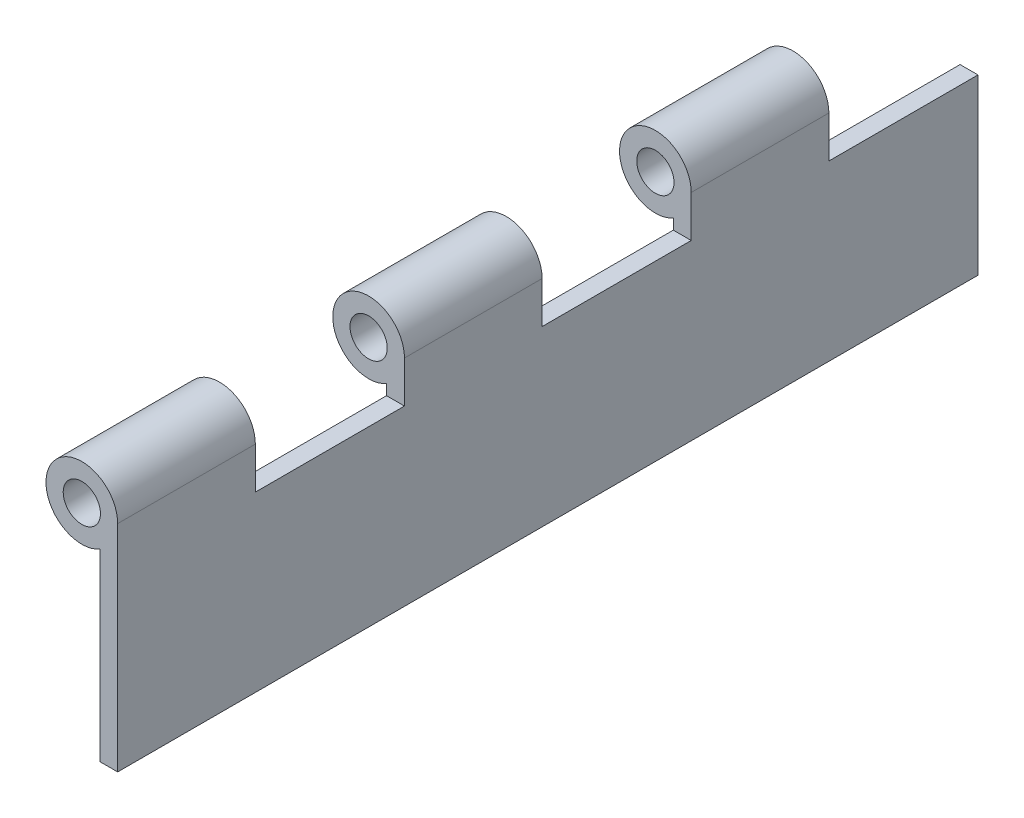
ISO-10303-21;
HEADER;
FILE_DESCRIPTION(('STEP AP214'),'2;1');
FILE_NAME('part.step','',(''),(''),'','','');
FILE_SCHEMA(('AUTOMOTIVE_DESIGN { 1 0 10303 214 1 1 1 1 }'));
ENDSEC;
DATA;
#1=APPLICATION_CONTEXT('core data for automotive mechanical design processes');
#2=APPLICATION_PROTOCOL_DEFINITION('international standard','automotive_design',2000,#1);
#3=PRODUCT_CONTEXT('',#1,'mechanical');
#4=PRODUCT('Part','Part','',(#3));
#5=PRODUCT_RELATED_PRODUCT_CATEGORY('part','',(#4));
#6=PRODUCT_DEFINITION_FORMATION('','',#4);
#7=PRODUCT_DEFINITION_CONTEXT('part definition',#1,'design');
#8=PRODUCT_DEFINITION('design','',#6,#7);
#9=PRODUCT_DEFINITION_SHAPE('','',#8);
#10=(LENGTH_UNIT() NAMED_UNIT(*) SI_UNIT(.MILLI.,.METRE.));
#11=(NAMED_UNIT(*) PLANE_ANGLE_UNIT() SI_UNIT($,.RADIAN.));
#12=(NAMED_UNIT(*) SI_UNIT($,.STERADIAN.) SOLID_ANGLE_UNIT());
#13=UNCERTAINTY_MEASURE_WITH_UNIT(LENGTH_MEASURE(1.E-05),#10,'distance_accuracy_value','');
#14=(GEOMETRIC_REPRESENTATION_CONTEXT(3) GLOBAL_UNCERTAINTY_ASSIGNED_CONTEXT((#13)) GLOBAL_UNIT_ASSIGNED_CONTEXT((#10,
#11,#12)) REPRESENTATION_CONTEXT('',''));
#15=CARTESIAN_POINT('',(0.,0.,0.));
#16=DIRECTION('',(0.,0.,1.));
#17=DIRECTION('',(1.,0.,0.));
#18=AXIS2_PLACEMENT_3D('',#15,#16,#17);
#19=CARTESIAN_POINT('',(-1.58750000000001,19.05,76.2));
#20=DIRECTION('',(0.,0.,-1.));
#21=DIRECTION('',(-1.,0.,0.));
#22=AXIS2_PLACEMENT_3D('',#19,#20,#21);
#23=CYLINDRICAL_SURFACE('',#22,1.651);
#24=CARTESIAN_POINT('',(-1.58750000000001,19.05,25.4));
#25=DIRECTION('',(0.,0.,-1.));
#26=DIRECTION('',(-1.,0.,0.));
#27=AXIS2_PLACEMENT_3D('',#24,#25,#26);
#28=CIRCLE('',#27,1.651);
#29=CARTESIAN_POINT('',(-3.23850000000001,19.05,25.4));
#30=VERTEX_POINT('',#29);
#31=EDGE_CURVE('E196',#30,#30,#28,.F.);
#32=ORIENTED_EDGE('',*,*,#31,.T.);
#33=EDGE_LOOP('',(#32));
#34=FACE_BOUND('',#33,.T.);
#35=CARTESIAN_POINT('',(-1.58750000000001,19.05,13.208));
#36=DIRECTION('',(0.,0.,-1.));
#37=DIRECTION('',(-1.,0.,0.));
#38=AXIS2_PLACEMENT_3D('',#35,#36,#37);
#39=CIRCLE('',#38,1.651);
#40=CARTESIAN_POINT('',(-3.23850000000001,19.05,13.208));
#41=VERTEX_POINT('',#40);
#42=EDGE_CURVE('E20',#41,#41,#39,.T.);
#43=ORIENTED_EDGE('',*,*,#42,.T.);
#44=EDGE_LOOP('',(#43));
#45=FACE_BOUND('',#44,.T.);
#46=ADVANCED_FACE('F17',(#34,#45),#23,.F.);
#47=CARTESIAN_POINT('',(-1.58750000000001,19.05,76.2));
#48=DIRECTION('',(0.,0.,-1.));
#49=DIRECTION('',(-1.,0.,0.));
#50=AXIS2_PLACEMENT_3D('',#47,#48,#49);
#51=CYLINDRICAL_SURFACE('',#50,1.651);
#52=CARTESIAN_POINT('',(-1.58750000000001,19.05,38.608));
#53=DIRECTION('',(0.,0.,-1.));
#54=DIRECTION('',(-1.,0.,0.));
#55=AXIS2_PLACEMENT_3D('',#52,#53,#54);
#56=CIRCLE('',#55,1.651);
#57=CARTESIAN_POINT('',(-3.23850000000001,19.05,38.608));
#58=VERTEX_POINT('',#57);
#59=EDGE_CURVE('E219',#58,#58,#56,.T.);
#60=ORIENTED_EDGE('',*,*,#59,.T.);
#61=EDGE_LOOP('',(#60));
#62=FACE_BOUND('',#61,.T.);
#63=CARTESIAN_POINT('',(-1.58750000000001,19.05,50.8));
#64=DIRECTION('',(0.,0.,-1.));
#65=DIRECTION('',(-1.,0.,0.));
#66=AXIS2_PLACEMENT_3D('',#63,#64,#65);
#67=CIRCLE('',#66,1.651);
#68=CARTESIAN_POINT('',(-3.23850000000001,19.05,50.8));
#69=VERTEX_POINT('',#68);
#70=EDGE_CURVE('E184',#69,#69,#67,.F.);
#71=ORIENTED_EDGE('',*,*,#70,.T.);
#72=EDGE_LOOP('',(#71));
#73=FACE_BOUND('',#72,.T.);
#74=ADVANCED_FACE('F374',(#62,#73),#51,.F.);
#75=CARTESIAN_POINT('',(-1.58750000000001,19.05,76.2));
#76=DIRECTION('',(0.,0.,-1.));
#77=DIRECTION('',(-1.,0.,0.));
#78=AXIS2_PLACEMENT_3D('',#75,#76,#77);
#79=CYLINDRICAL_SURFACE('',#78,1.651);
#80=CARTESIAN_POINT('',(-1.58750000000001,19.05,64.008));
#81=DIRECTION('',(0.,0.,-1.));
#82=DIRECTION('',(-1.,0.,0.));
#83=AXIS2_PLACEMENT_3D('',#80,#81,#82);
#84=CIRCLE('',#83,1.651);
#85=CARTESIAN_POINT('',(-3.23850000000001,19.05,64.008));
#86=VERTEX_POINT('',#85);
#87=EDGE_CURVE('E209',#86,#86,#84,.T.);
#88=ORIENTED_EDGE('',*,*,#87,.T.);
#89=EDGE_LOOP('',(#88));
#90=FACE_BOUND('',#89,.T.);
#91=CARTESIAN_POINT('',(-1.58750000000001,19.05,76.2));
#92=DIRECTION('',(0.,0.,-1.));
#93=DIRECTION('',(-1.,0.,0.));
#94=AXIS2_PLACEMENT_3D('',#91,#92,#93);
#95=CIRCLE('',#94,1.651);
#96=CARTESIAN_POINT('',(-3.23850000000001,19.05,76.2));
#97=VERTEX_POINT('',#96);
#98=EDGE_CURVE('E201',#97,#97,#95,.T.);
#99=ORIENTED_EDGE('',*,*,#98,.F.);
#100=EDGE_LOOP('',(#99));
#101=FACE_BOUND('',#100,.T.);
#102=ADVANCED_FACE('F372',(#90,#101),#79,.F.);
#103=CARTESIAN_POINT('',(0.,0.,0.));
#104=DIRECTION('',(-1.,0.,0.));
#105=DIRECTION('',(0.,-1.,0.));
#106=AXIS2_PLACEMENT_3D('',#103,#104,#105);
#107=PLANE('',#106);
#108=DIRECTION('',(0.,0.,1.));
#109=VECTOR('',#108,1.);
#110=CARTESIAN_POINT('',(0.,16.3003693429844,0.));
#111=LINE('',#110,#109);
#112=CARTESIAN_POINT('',(0.,16.3003693429844,13.208));
#113=VERTEX_POINT('',#112);
#114=CARTESIAN_POINT('',(0.,16.3003693429844,25.4));
#115=VERTEX_POINT('',#114);
#116=EDGE_CURVE('E127',#113,#115,#111,.T.);
#117=ORIENTED_EDGE('',*,*,#116,.F.);
#118=DIRECTION('',(0.,1.,0.));
#119=VECTOR('',#118,1.);
#120=CARTESIAN_POINT('',(0.,22.225,13.208));
#121=LINE('',#120,#119);
#122=CARTESIAN_POINT('',(0.,15.367,13.208));
#123=VERTEX_POINT('',#122);
#124=EDGE_CURVE('E123',#113,#123,#121,.F.);
#125=ORIENTED_EDGE('',*,*,#124,.T.);
#126=DIRECTION('',(0.,0.,1.));
#127=VECTOR('',#126,1.);
#128=CARTESIAN_POINT('',(0.,15.367,6.604));
#129=LINE('',#128,#127);
#130=CARTESIAN_POINT('',(0.,15.367,0.));
#131=VERTEX_POINT('',#130);
#132=EDGE_CURVE('E151',#131,#123,#129,.T.);
#133=ORIENTED_EDGE('',*,*,#132,.F.);
#134=DIRECTION('',(0.,1.,0.));
#135=VECTOR('',#134,1.);
#136=CARTESIAN_POINT('',(0.,11.825400192215,0.));
#137=LINE('',#136,#135);
#138=CARTESIAN_POINT('',(0.,0.,0.));
#139=VERTEX_POINT('',#138);
#140=EDGE_CURVE('E161',#131,#139,#137,.F.);
#141=ORIENTED_EDGE('',*,*,#140,.T.);
#142=DIRECTION('',(0.,0.,1.));
#143=VECTOR('',#142,1.);
#144=CARTESIAN_POINT('',(0.,0.,0.));
#145=LINE('',#144,#143);
#146=CARTESIAN_POINT('',(0.,0.,76.2));
#147=VERTEX_POINT('',#146);
#148=EDGE_CURVE('E163',#147,#139,#145,.F.);
#149=ORIENTED_EDGE('',*,*,#148,.F.);
#150=DIRECTION('',(0.,1.,0.));
#151=VECTOR('',#150,1.);
#152=CARTESIAN_POINT('',(0.,11.825400192215,76.2));
#153=LINE('',#152,#151);
#154=CARTESIAN_POINT('',(0.,16.3003693429844,76.2));
#155=VERTEX_POINT('',#154);
#156=EDGE_CURVE('E204',#155,#147,#153,.F.);
#157=ORIENTED_EDGE('',*,*,#156,.F.);
#158=DIRECTION('',(0.,0.,1.));
#159=VECTOR('',#158,1.);
#160=CARTESIAN_POINT('',(0.,16.3003693429844,0.));
#161=LINE('',#160,#159);
#162=CARTESIAN_POINT('',(0.,16.3003693429844,64.008));
#163=VERTEX_POINT('',#162);
#164=EDGE_CURVE('E176',#163,#155,#161,.T.);
#165=ORIENTED_EDGE('',*,*,#164,.F.);
#166=DIRECTION('',(0.,1.,0.));
#167=VECTOR('',#166,1.);
#168=CARTESIAN_POINT('',(0.,22.225,64.008));
#169=LINE('',#168,#167);
#170=CARTESIAN_POINT('',(0.,15.367,64.008));
#171=VERTEX_POINT('',#170);
#172=EDGE_CURVE('E270',#163,#171,#169,.F.);
#173=ORIENTED_EDGE('',*,*,#172,.T.);
#174=DIRECTION('',(0.,0.,1.));
#175=VECTOR('',#174,1.);
#176=CARTESIAN_POINT('',(0.,15.367,57.404));
#177=LINE('',#176,#175);
#178=CARTESIAN_POINT('',(0.,15.367,50.8));
#179=VERTEX_POINT('',#178);
#180=EDGE_CURVE('E180',#179,#171,#177,.T.);
#181=ORIENTED_EDGE('',*,*,#180,.F.);
#182=DIRECTION('',(0.,1.,0.));
#183=VECTOR('',#182,1.);
#184=CARTESIAN_POINT('',(0.,22.225,50.8));
#185=LINE('',#184,#183);
#186=CARTESIAN_POINT('',(0.,16.3003693429844,50.8));
#187=VERTEX_POINT('',#186);
#188=EDGE_CURVE('E190',#179,#187,#185,.T.);
#189=ORIENTED_EDGE('',*,*,#188,.T.);
#190=DIRECTION('',(0.,0.,1.));
#191=VECTOR('',#190,1.);
#192=CARTESIAN_POINT('',(0.,16.3003693429844,0.));
#193=LINE('',#192,#191);
#194=CARTESIAN_POINT('',(0.,16.3003693429844,38.608));
#195=VERTEX_POINT('',#194);
#196=EDGE_CURVE('E187',#195,#187,#193,.T.);
#197=ORIENTED_EDGE('',*,*,#196,.F.);
#198=DIRECTION('',(0.,1.,0.));
#199=VECTOR('',#198,1.);
#200=CARTESIAN_POINT('',(0.,22.225,38.608));
#201=LINE('',#200,#199);
#202=CARTESIAN_POINT('',(0.,15.367,38.608));
#203=VERTEX_POINT('',#202);
#204=EDGE_CURVE('E238',#195,#203,#201,.F.);
#205=ORIENTED_EDGE('',*,*,#204,.T.);
#206=DIRECTION('',(0.,0.,1.));
#207=VECTOR('',#206,1.);
#208=CARTESIAN_POINT('',(0.,15.367,32.004));
#209=LINE('',#208,#207);
#210=CARTESIAN_POINT('',(0.,15.367,25.4));
#211=VERTEX_POINT('',#210);
#212=EDGE_CURVE('E192',#211,#203,#209,.T.);
#213=ORIENTED_EDGE('',*,*,#212,.F.);
#214=DIRECTION('',(0.,1.,0.));
#215=VECTOR('',#214,1.);
#216=CARTESIAN_POINT('',(0.,22.225,25.4));
#217=LINE('',#216,#215);
#218=EDGE_CURVE('E200',#211,#115,#217,.T.);
#219=ORIENTED_EDGE('',*,*,#218,.T.);
#220=EDGE_LOOP('',(#117,#125,#133,#141,#149,#157,#165,#173,#181,#189,#197,#205,#213,#219));
#221=FACE_BOUND('',#220,.T.);
#222=ADVANCED_FACE('F313',(#221),#107,.T.);
#223=CARTESIAN_POINT('',(-4.7625,22.225,13.208));
#224=DIRECTION('',(0.,0.,1.));
#225=DIRECTION('',(1.,0.,0.));
#226=AXIS2_PLACEMENT_3D('',#223,#224,#225);
#227=PLANE('',#226);
#228=ORIENTED_EDGE('',*,*,#42,.F.);
#229=EDGE_LOOP('',(#228));
#230=FACE_BOUND('',#229,.T.);
#231=DIRECTION('',(0.,1.,0.));
#232=VECTOR('',#231,1.);
#233=CARTESIAN_POINT('',(1.58749999999999,19.05,13.208));
#234=LINE('',#233,#232);
#235=CARTESIAN_POINT('',(1.5875,15.367,13.208));
#236=VERTEX_POINT('',#235);
#237=CARTESIAN_POINT('',(1.58749999999999,19.05,13.208));
#238=VERTEX_POINT('',#237);
#239=EDGE_CURVE('E121',#236,#238,#234,.T.);
#240=ORIENTED_EDGE('',*,*,#239,.F.);
#241=DIRECTION('',(1.,0.,0.));
#242=VECTOR('',#241,1.);
#243=CARTESIAN_POINT('',(-1.58750000000001,15.367,13.208));
#244=LINE('',#243,#242);
#245=EDGE_CURVE('E141',#123,#236,#244,.T.);
#246=ORIENTED_EDGE('',*,*,#245,.F.);
#247=ORIENTED_EDGE('',*,*,#124,.F.);
#248=CARTESIAN_POINT('',(-1.58750000000001,19.05,13.208));
#249=DIRECTION('',(0.,0.,1.));
#250=DIRECTION('',(1.,0.,0.));
#251=AXIS2_PLACEMENT_3D('',#248,#249,#250);
#252=CIRCLE('',#251,3.175);
#253=EDGE_CURVE('E116',#238,#113,#252,.T.);
#254=ORIENTED_EDGE('',*,*,#253,.F.);
#255=EDGE_LOOP('',(#240,#246,#247,#254));
#256=FACE_BOUND('',#255,.T.);
#257=ADVANCED_FACE('F118',(#230,#256),#227,.F.);
#258=CARTESIAN_POINT('',(-1.58750000000001,19.05,0.));
#259=DIRECTION('',(0.,0.,1.));
#260=DIRECTION('',(1.,0.,0.));
#261=AXIS2_PLACEMENT_3D('',#258,#259,#260);
#262=CYLINDRICAL_SURFACE('',#261,3.175);
#263=CARTESIAN_POINT('',(-1.58750000000001,19.05,25.4));
#264=DIRECTION('',(0.,0.,1.));
#265=DIRECTION('',(1.,0.,0.));
#266=AXIS2_PLACEMENT_3D('',#263,#264,#265);
#267=CIRCLE('',#266,3.175);
#268=CARTESIAN_POINT('',(1.58749999999999,19.05,25.4));
#269=VERTEX_POINT('',#268);
#270=EDGE_CURVE('E132',#115,#269,#267,.F.);
#271=ORIENTED_EDGE('',*,*,#270,.T.);
#272=DIRECTION('',(0.,0.,1.));
#273=VECTOR('',#272,1.);
#274=CARTESIAN_POINT('',(1.58749999999999,19.05,0.));
#275=LINE('',#274,#273);
#276=EDGE_CURVE('E129',#238,#269,#275,.T.);
#277=ORIENTED_EDGE('',*,*,#276,.F.);
#278=ORIENTED_EDGE('',*,*,#253,.T.);
#279=ORIENTED_EDGE('',*,*,#116,.T.);
#280=EDGE_LOOP('',(#271,#277,#278,#279));
#281=FACE_BOUND('',#280,.T.);
#282=ADVANCED_FACE('F130',(#281),#262,.T.);
#283=CARTESIAN_POINT('',(1.5875,22.225,25.4));
#284=DIRECTION('',(0.,0.,-1.));
#285=DIRECTION('',(-1.,0.,0.));
#286=AXIS2_PLACEMENT_3D('',#283,#284,#285);
#287=PLANE('',#286);
#288=ORIENTED_EDGE('',*,*,#31,.F.);
#289=EDGE_LOOP('',(#288));
#290=FACE_BOUND('',#289,.T.);
#291=ORIENTED_EDGE('',*,*,#218,.F.);
#292=DIRECTION('',(1.,0.,0.));
#293=VECTOR('',#292,1.);
#294=CARTESIAN_POINT('',(-1.58750000000001,15.367,25.4));
#295=LINE('',#294,#293);
#296=CARTESIAN_POINT('',(1.5875,15.367,25.4));
#297=VERTEX_POINT('',#296);
#298=EDGE_CURVE('E195',#297,#211,#295,.F.);
#299=ORIENTED_EDGE('',*,*,#298,.F.);
#300=DIRECTION('',(0.,1.,0.));
#301=VECTOR('',#300,1.);
#302=CARTESIAN_POINT('',(1.58749999999999,19.05,25.4));
#303=LINE('',#302,#301);
#304=EDGE_CURVE('E136',#269,#297,#303,.F.);
#305=ORIENTED_EDGE('',*,*,#304,.F.);
#306=ORIENTED_EDGE('',*,*,#270,.F.);
#307=EDGE_LOOP('',(#291,#299,#305,#306));
#308=FACE_BOUND('',#307,.T.);
#309=ADVANCED_FACE('F360',(#290,#308),#287,.F.);
#310=CARTESIAN_POINT('',(-1.58750000000001,15.367,32.004));
#311=DIRECTION('',(0.,1.,0.));
#312=DIRECTION('',(0.,0.,1.));
#313=AXIS2_PLACEMENT_3D('',#310,#311,#312);
#314=PLANE('',#313);
#315=DIRECTION('',(0.,0.,1.));
#316=VECTOR('',#315,1.);
#317=CARTESIAN_POINT('',(1.5875,15.367,0.));
#318=LINE('',#317,#316);
#319=CARTESIAN_POINT('',(1.5875,15.367,38.608));
#320=VERTEX_POINT('',#319);
#321=EDGE_CURVE('E233',#297,#320,#318,.T.);
#322=ORIENTED_EDGE('',*,*,#321,.F.);
#323=ORIENTED_EDGE('',*,*,#298,.T.);
#324=ORIENTED_EDGE('',*,*,#212,.T.);
#325=DIRECTION('',(1.,0.,0.));
#326=VECTOR('',#325,1.);
#327=CARTESIAN_POINT('',(-4.7625,15.367,38.608));
#328=LINE('',#327,#326);
#329=EDGE_CURVE('E222',#203,#320,#328,.T.);
#330=ORIENTED_EDGE('',*,*,#329,.T.);
#331=EDGE_LOOP('',(#322,#323,#324,#330));
#332=FACE_BOUND('',#331,.T.);
#333=ADVANCED_FACE('F356',(#332),#314,.T.);
#334=CARTESIAN_POINT('',(-4.7625,22.225,38.608));
#335=DIRECTION('',(0.,0.,1.));
#336=DIRECTION('',(1.,0.,0.));
#337=AXIS2_PLACEMENT_3D('',#334,#335,#336);
#338=PLANE('',#337);
#339=ORIENTED_EDGE('',*,*,#59,.F.);
#340=EDGE_LOOP('',(#339));
#341=FACE_BOUND('',#340,.T.);
#342=DIRECTION('',(0.,1.,0.));
#343=VECTOR('',#342,1.);
#344=CARTESIAN_POINT('',(1.58749999999999,19.05,38.608));
#345=LINE('',#344,#343);
#346=CARTESIAN_POINT('',(1.58749999999999,19.05,38.608));
#347=VERTEX_POINT('',#346);
#348=EDGE_CURVE('E243',#320,#347,#345,.T.);
#349=ORIENTED_EDGE('',*,*,#348,.F.);
#350=ORIENTED_EDGE('',*,*,#329,.F.);
#351=ORIENTED_EDGE('',*,*,#204,.F.);
#352=CARTESIAN_POINT('',(-1.58750000000001,19.05,38.608));
#353=DIRECTION('',(0.,0.,1.));
#354=DIRECTION('',(1.,0.,0.));
#355=AXIS2_PLACEMENT_3D('',#352,#353,#354);
#356=CIRCLE('',#355,3.175);
#357=EDGE_CURVE('E191',#347,#195,#356,.T.);
#358=ORIENTED_EDGE('',*,*,#357,.F.);
#359=EDGE_LOOP('',(#349,#350,#351,#358));
#360=FACE_BOUND('',#359,.T.);
#361=ADVANCED_FACE('F352',(#341,#360),#338,.F.);
#362=CARTESIAN_POINT('',(-1.58750000000001,19.05,0.));
#363=DIRECTION('',(0.,0.,1.));
#364=DIRECTION('',(1.,0.,0.));
#365=AXIS2_PLACEMENT_3D('',#362,#363,#364);
#366=CYLINDRICAL_SURFACE('',#365,3.175);
#367=CARTESIAN_POINT('',(-1.58750000000001,19.05,50.8));
#368=DIRECTION('',(0.,0.,1.));
#369=DIRECTION('',(1.,0.,0.));
#370=AXIS2_PLACEMENT_3D('',#367,#368,#369);
#371=CIRCLE('',#370,3.175);
#372=CARTESIAN_POINT('',(1.58749999999999,19.05,50.8));
#373=VERTEX_POINT('',#372);
#374=EDGE_CURVE('E215',#187,#373,#371,.F.);
#375=ORIENTED_EDGE('',*,*,#374,.T.);
#376=DIRECTION('',(0.,0.,1.));
#377=VECTOR('',#376,1.);
#378=CARTESIAN_POINT('',(1.58749999999999,19.05,0.));
#379=LINE('',#378,#377);
#380=EDGE_CURVE('E254',#347,#373,#379,.T.);
#381=ORIENTED_EDGE('',*,*,#380,.F.);
#382=ORIENTED_EDGE('',*,*,#357,.T.);
#383=ORIENTED_EDGE('',*,*,#196,.T.);
#384=EDGE_LOOP('',(#375,#381,#382,#383));
#385=FACE_BOUND('',#384,.T.);
#386=ADVANCED_FACE('F348',(#385),#366,.T.);
#387=CARTESIAN_POINT('',(1.5875,22.225,50.8));
#388=DIRECTION('',(0.,0.,-1.));
#389=DIRECTION('',(-1.,0.,0.));
#390=AXIS2_PLACEMENT_3D('',#387,#388,#389);
#391=PLANE('',#390);
#392=ORIENTED_EDGE('',*,*,#70,.F.);
#393=EDGE_LOOP('',(#392));
#394=FACE_BOUND('',#393,.T.);
#395=ORIENTED_EDGE('',*,*,#188,.F.);
#396=DIRECTION('',(1.,0.,0.));
#397=VECTOR('',#396,1.);
#398=CARTESIAN_POINT('',(-1.58750000000001,15.367,50.8));
#399=LINE('',#398,#397);
#400=CARTESIAN_POINT('',(1.5875,15.367,50.8));
#401=VERTEX_POINT('',#400);
#402=EDGE_CURVE('E183',#401,#179,#399,.F.);
#403=ORIENTED_EDGE('',*,*,#402,.F.);
#404=DIRECTION('',(0.,1.,0.));
#405=VECTOR('',#404,1.);
#406=CARTESIAN_POINT('',(1.58749999999999,19.05,50.8));
#407=LINE('',#406,#405);
#408=EDGE_CURVE('E257',#373,#401,#407,.F.);
#409=ORIENTED_EDGE('',*,*,#408,.F.);
#410=ORIENTED_EDGE('',*,*,#374,.F.);
#411=EDGE_LOOP('',(#395,#403,#409,#410));
#412=FACE_BOUND('',#411,.T.);
#413=ADVANCED_FACE('F344',(#394,#412),#391,.F.);
#414=CARTESIAN_POINT('',(-1.58750000000001,15.367,57.404));
#415=DIRECTION('',(0.,1.,0.));
#416=DIRECTION('',(0.,0.,1.));
#417=AXIS2_PLACEMENT_3D('',#414,#415,#416);
#418=PLANE('',#417);
#419=DIRECTION('',(0.,0.,1.));
#420=VECTOR('',#419,1.);
#421=CARTESIAN_POINT('',(1.5875,15.367,0.));
#422=LINE('',#421,#420);
#423=CARTESIAN_POINT('',(1.5875,15.367,64.008));
#424=VERTEX_POINT('',#423);
#425=EDGE_CURVE('E265',#401,#424,#422,.T.);
#426=ORIENTED_EDGE('',*,*,#425,.F.);
#427=ORIENTED_EDGE('',*,*,#402,.T.);
#428=ORIENTED_EDGE('',*,*,#180,.T.);
#429=DIRECTION('',(1.,0.,0.));
#430=VECTOR('',#429,1.);
#431=CARTESIAN_POINT('',(-4.7625,15.367,64.008));
#432=LINE('',#431,#430);
#433=EDGE_CURVE('E212',#171,#424,#432,.T.);
#434=ORIENTED_EDGE('',*,*,#433,.T.);
#435=EDGE_LOOP('',(#426,#427,#428,#434));
#436=FACE_BOUND('',#435,.T.);
#437=ADVANCED_FACE('F340',(#436),#418,.T.);
#438=CARTESIAN_POINT('',(-4.7625,22.225,64.008));
#439=DIRECTION('',(0.,0.,1.));
#440=DIRECTION('',(1.,0.,0.));
#441=AXIS2_PLACEMENT_3D('',#438,#439,#440);
#442=PLANE('',#441);
#443=ORIENTED_EDGE('',*,*,#87,.F.);
#444=EDGE_LOOP('',(#443));
#445=FACE_BOUND('',#444,.T.);
#446=DIRECTION('',(0.,1.,0.));
#447=VECTOR('',#446,1.);
#448=CARTESIAN_POINT('',(1.58749999999999,19.05,64.008));
#449=LINE('',#448,#447);
#450=CARTESIAN_POINT('',(1.58749999999999,19.05,64.008));
#451=VERTEX_POINT('',#450);
#452=EDGE_CURVE('E275',#424,#451,#449,.T.);
#453=ORIENTED_EDGE('',*,*,#452,.F.);
#454=ORIENTED_EDGE('',*,*,#433,.F.);
#455=ORIENTED_EDGE('',*,*,#172,.F.);
#456=CARTESIAN_POINT('',(-1.58750000000001,19.05,64.008));
#457=DIRECTION('',(0.,0.,1.));
#458=DIRECTION('',(1.,0.,0.));
#459=AXIS2_PLACEMENT_3D('',#456,#457,#458);
#460=CIRCLE('',#459,3.175);
#461=EDGE_CURVE('E179',#451,#163,#460,.T.);
#462=ORIENTED_EDGE('',*,*,#461,.F.);
#463=EDGE_LOOP('',(#453,#454,#455,#462));
#464=FACE_BOUND('',#463,.T.);
#465=ADVANCED_FACE('F336',(#445,#464),#442,.F.);
#466=CARTESIAN_POINT('',(-1.58750000000001,19.05,0.));
#467=DIRECTION('',(0.,0.,1.));
#468=DIRECTION('',(1.,0.,0.));
#469=AXIS2_PLACEMENT_3D('',#466,#467,#468);
#470=CYLINDRICAL_SURFACE('',#469,3.175);
#471=CARTESIAN_POINT('',(-1.58750000000001,19.05,76.2));
#472=DIRECTION('',(0.,0.,1.));
#473=DIRECTION('',(1.,0.,0.));
#474=AXIS2_PLACEMENT_3D('',#471,#472,#473);
#475=CIRCLE('',#474,3.175);
#476=CARTESIAN_POINT('',(1.58749999999999,19.05,76.2));
#477=VERTEX_POINT('',#476);
#478=EDGE_CURVE('E178',#477,#155,#475,.T.);
#479=ORIENTED_EDGE('',*,*,#478,.F.);
#480=DIRECTION('',(0.,0.,1.));
#481=VECTOR('',#480,1.);
#482=CARTESIAN_POINT('',(1.58749999999999,19.05,0.));
#483=LINE('',#482,#481);
#484=EDGE_CURVE('E286',#451,#477,#483,.T.);
#485=ORIENTED_EDGE('',*,*,#484,.F.);
#486=ORIENTED_EDGE('',*,*,#461,.T.);
#487=ORIENTED_EDGE('',*,*,#164,.T.);
#488=EDGE_LOOP('',(#479,#485,#486,#487));
#489=FACE_BOUND('',#488,.T.);
#490=ADVANCED_FACE('F332',(#489),#470,.T.);
#491=CARTESIAN_POINT('',(0.0178378172368279,11.825400192215,76.2));
#492=DIRECTION('',(0.,0.,1.));
#493=DIRECTION('',(1.,0.,0.));
#494=AXIS2_PLACEMENT_3D('',#491,#492,#493);
#495=PLANE('',#494);
#496=ORIENTED_EDGE('',*,*,#98,.T.);
#497=EDGE_LOOP('',(#496));
#498=FACE_BOUND('',#497,.T.);
#499=DIRECTION('',(1.,0.,0.));
#500=VECTOR('',#499,1.);
#501=CARTESIAN_POINT('',(1.5875,0.,76.2));
#502=LINE('',#501,#500);
#503=CARTESIAN_POINT('',(1.5875,0.,76.2));
#504=VERTEX_POINT('',#503);
#505=EDGE_CURVE('E170',#504,#147,#502,.F.);
#506=ORIENTED_EDGE('',*,*,#505,.F.);
#507=DIRECTION('',(0.,1.,0.));
#508=VECTOR('',#507,1.);
#509=CARTESIAN_POINT('',(1.58749999999999,19.05,76.2));
#510=LINE('',#509,#508);
#511=EDGE_CURVE('E296',#477,#504,#510,.F.);
#512=ORIENTED_EDGE('',*,*,#511,.F.);
#513=ORIENTED_EDGE('',*,*,#478,.T.);
#514=ORIENTED_EDGE('',*,*,#156,.T.);
#515=EDGE_LOOP('',(#506,#512,#513,#514));
#516=FACE_BOUND('',#515,.T.);
#517=ADVANCED_FACE('F329',(#498,#516),#495,.T.);
#518=CARTESIAN_POINT('',(1.5875,0.,0.));
#519=DIRECTION('',(0.,-1.,0.));
#520=DIRECTION('',(1.,0.,0.));
#521=AXIS2_PLACEMENT_3D('',#518,#519,#520);
#522=PLANE('',#521);
#523=DIRECTION('',(1.,0.,0.));
#524=VECTOR('',#523,1.);
#525=CARTESIAN_POINT('',(0.0178378172368279,0.,0.));
#526=LINE('',#525,#524);
#527=CARTESIAN_POINT('',(1.5875,0.,0.));
#528=VERTEX_POINT('',#527);
#529=EDGE_CURVE('E158',#139,#528,#526,.T.);
#530=ORIENTED_EDGE('',*,*,#529,.T.);
#531=DIRECTION('',(0.,0.,1.));
#532=VECTOR('',#531,1.);
#533=CARTESIAN_POINT('',(1.5875,0.,0.));
#534=LINE('',#533,#532);
#535=EDGE_CURVE('E293',#504,#528,#534,.F.);
#536=ORIENTED_EDGE('',*,*,#535,.F.);
#537=ORIENTED_EDGE('',*,*,#505,.T.);
#538=ORIENTED_EDGE('',*,*,#148,.T.);
#539=EDGE_LOOP('',(#530,#536,#537,#538));
#540=FACE_BOUND('',#539,.T.);
#541=ADVANCED_FACE('F310',(#540),#522,.T.);
#542=CARTESIAN_POINT('',(0.0178378172368279,11.825400192215,0.));
#543=DIRECTION('',(0.,0.,1.));
#544=DIRECTION('',(1.,0.,0.));
#545=AXIS2_PLACEMENT_3D('',#542,#543,#544);
#546=PLANE('',#545);
#547=DIRECTION('',(0.,1.,0.));
#548=VECTOR('',#547,1.);
#549=CARTESIAN_POINT('',(1.58749999999999,19.05,0.));
#550=LINE('',#549,#548);
#551=CARTESIAN_POINT('',(1.5875,15.367,0.));
#552=VERTEX_POINT('',#551);
#553=EDGE_CURVE('E26',#528,#552,#550,.T.);
#554=ORIENTED_EDGE('',*,*,#553,.F.);
#555=ORIENTED_EDGE('',*,*,#529,.F.);
#556=ORIENTED_EDGE('',*,*,#140,.F.);
#557=DIRECTION('',(1.,0.,0.));
#558=VECTOR('',#557,1.);
#559=CARTESIAN_POINT('',(-1.58750000000001,15.367,0.));
#560=LINE('',#559,#558);
#561=EDGE_CURVE('E35',#552,#131,#560,.F.);
#562=ORIENTED_EDGE('',*,*,#561,.F.);
#563=EDGE_LOOP('',(#554,#555,#556,#562));
#564=FACE_BOUND('',#563,.T.);
#565=ADVANCED_FACE('F308',(#564),#546,.F.);
#566=CARTESIAN_POINT('',(-1.58750000000001,15.367,6.604));
#567=DIRECTION('',(0.,1.,0.));
#568=DIRECTION('',(0.,0.,1.));
#569=AXIS2_PLACEMENT_3D('',#566,#567,#568);
#570=PLANE('',#569);
#571=DIRECTION('',(0.,0.,1.));
#572=VECTOR('',#571,1.);
#573=CARTESIAN_POINT('',(1.5875,15.367,0.));
#574=LINE('',#573,#572);
#575=EDGE_CURVE('E11',#552,#236,#574,.T.);
#576=ORIENTED_EDGE('',*,*,#575,.F.);
#577=ORIENTED_EDGE('',*,*,#561,.T.);
#578=ORIENTED_EDGE('',*,*,#132,.T.);
#579=ORIENTED_EDGE('',*,*,#245,.T.);
#580=EDGE_LOOP('',(#576,#577,#578,#579));
#581=FACE_BOUND('',#580,.T.);
#582=ADVANCED_FACE('F316',(#581),#570,.T.);
#583=CARTESIAN_POINT('',(1.58749999999999,19.05,0.));
#584=DIRECTION('',(1.,0.,0.));
#585=DIRECTION('',(0.,1.,0.));
#586=AXIS2_PLACEMENT_3D('',#583,#584,#585);
#587=PLANE('',#586);
#588=ORIENTED_EDGE('',*,*,#553,.T.);
#589=ORIENTED_EDGE('',*,*,#575,.T.);
#590=ORIENTED_EDGE('',*,*,#239,.T.);
#591=ORIENTED_EDGE('',*,*,#276,.T.);
#592=ORIENTED_EDGE('',*,*,#304,.T.);
#593=ORIENTED_EDGE('',*,*,#321,.T.);
#594=ORIENTED_EDGE('',*,*,#348,.T.);
#595=ORIENTED_EDGE('',*,*,#380,.T.);
#596=ORIENTED_EDGE('',*,*,#408,.T.);
#597=ORIENTED_EDGE('',*,*,#425,.T.);
#598=ORIENTED_EDGE('',*,*,#452,.T.);
#599=ORIENTED_EDGE('',*,*,#484,.T.);
#600=ORIENTED_EDGE('',*,*,#511,.T.);
#601=ORIENTED_EDGE('',*,*,#535,.T.);
#602=EDGE_LOOP('',(#588,#589,#590,#591,#592,#593,#594,#595,#596,#597,#598,#599,#600,#601));
#603=FACE_BOUND('',#602,.T.);
#604=ADVANCED_FACE('F139',(#603),#587,.T.);
#605=CLOSED_SHELL('',(#46,#74,#102,#222,#257,#282,#309,#333,#361,#386,#413,#437,#465,#490,#517,
#541,#565,#582,#604));
#606=MANIFOLD_SOLID_BREP('B1',#605);
#607=ADVANCED_BREP_SHAPE_REPRESENTATION('',(#18,#606),#14);
#608=SHAPE_DEFINITION_REPRESENTATION(#9,#607);
ENDSEC;
END-ISO-10303-21;
